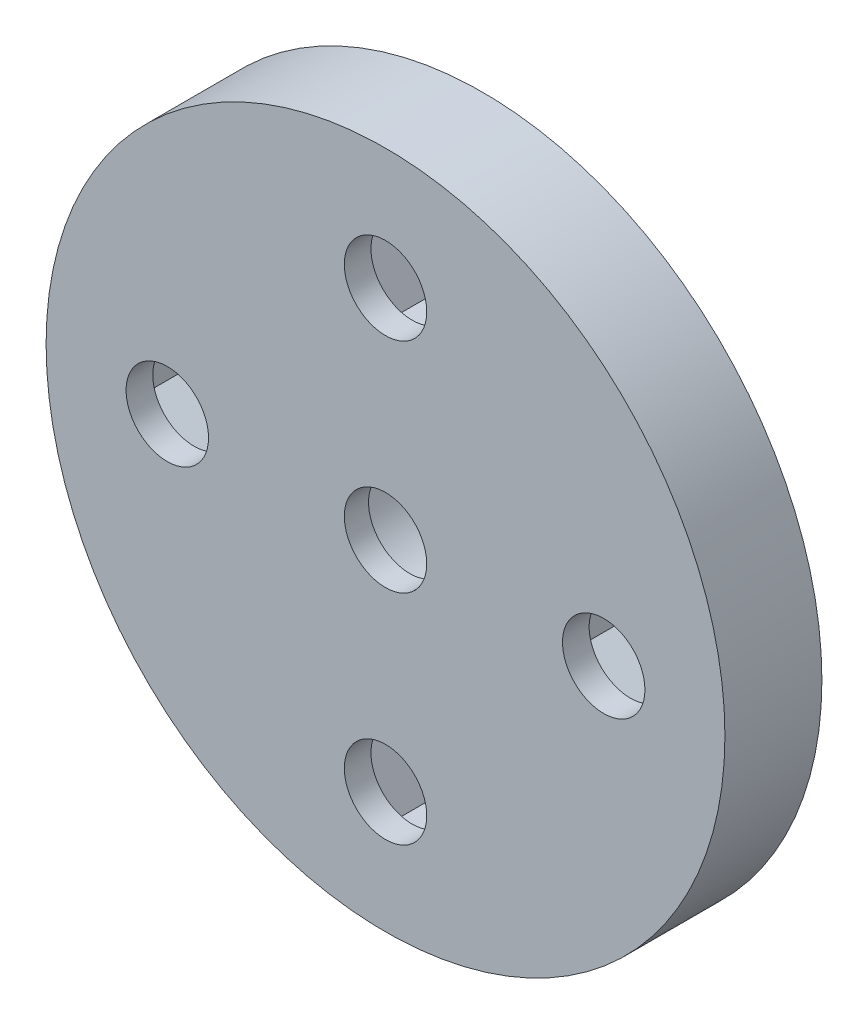
ISO-10303-21;
HEADER;
FILE_DESCRIPTION(('STEP AP214'),'2;1');
FILE_NAME('part.step','',(''),(''),'','','');
FILE_SCHEMA(('AUTOMOTIVE_DESIGN { 1 0 10303 214 1 1 1 1 }'));
ENDSEC;
DATA;
#1=APPLICATION_CONTEXT('core data for automotive mechanical design processes');
#2=APPLICATION_PROTOCOL_DEFINITION('international standard','automotive_design',2000,#1);
#3=PRODUCT_CONTEXT('',#1,'mechanical');
#4=PRODUCT('Part','Part','',(#3));
#5=PRODUCT_RELATED_PRODUCT_CATEGORY('part','',(#4));
#6=PRODUCT_DEFINITION_FORMATION('','',#4);
#7=PRODUCT_DEFINITION_CONTEXT('part definition',#1,'design');
#8=PRODUCT_DEFINITION('design','',#6,#7);
#9=PRODUCT_DEFINITION_SHAPE('','',#8);
#10=(LENGTH_UNIT() NAMED_UNIT(*) SI_UNIT(.MILLI.,.METRE.));
#11=(NAMED_UNIT(*) PLANE_ANGLE_UNIT() SI_UNIT($,.RADIAN.));
#12=(NAMED_UNIT(*) SI_UNIT($,.STERADIAN.) SOLID_ANGLE_UNIT());
#13=UNCERTAINTY_MEASURE_WITH_UNIT(LENGTH_MEASURE(1.E-05),#10,'distance_accuracy_value','');
#14=(GEOMETRIC_REPRESENTATION_CONTEXT(3) GLOBAL_UNCERTAINTY_ASSIGNED_CONTEXT((#13)) GLOBAL_UNIT_ASSIGNED_CONTEXT((#10,
#11,#12)) REPRESENTATION_CONTEXT('',''));
#15=CARTESIAN_POINT('',(0.,0.,0.));
#16=DIRECTION('',(0.,0.,1.));
#17=DIRECTION('',(1.,0.,0.));
#18=AXIS2_PLACEMENT_3D('',#15,#16,#17);
#19=CARTESIAN_POINT('',(0.,0.,0.));
#20=DIRECTION('',(0.,0.,1.));
#21=DIRECTION('',(1.,0.,0.));
#22=AXIS2_PLACEMENT_3D('',#19,#20,#21);
#23=PLANE('',#22);
#24=DIRECTION('',(-1.,0.,0.));
#25=VECTOR('',#24,1.);
#26=CARTESIAN_POINT('',(1.64544826719043,11.85,0.));
#27=LINE('',#26,#25);
#28=CARTESIAN_POINT('',(1.64544826719043,11.85,0.));
#29=VERTEX_POINT('',#28);
#30=CARTESIAN_POINT('',(-1.64544826719043,11.85,0.));
#31=VERTEX_POINT('',#30);
#32=EDGE_CURVE('E72',#29,#31,#27,.T.);
#33=ORIENTED_EDGE('',*,*,#32,.T.);
#34=DIRECTION('',(-0.5,-0.866025403784439,0.));
#35=VECTOR('',#34,1.);
#36=CARTESIAN_POINT('',(-1.64544826719043,11.85,0.));
#37=LINE('',#36,#35);
#38=CARTESIAN_POINT('',(-3.29089653438087,9.,0.));
#39=VERTEX_POINT('',#38);
#40=EDGE_CURVE('E281',#31,#39,#37,.T.);
#41=ORIENTED_EDGE('',*,*,#40,.T.);
#42=DIRECTION('',(0.5,-0.866025403784439,0.));
#43=VECTOR('',#42,1.);
#44=CARTESIAN_POINT('',(-3.29089653438087,9.,0.));
#45=LINE('',#44,#43);
#46=CARTESIAN_POINT('',(-1.64544826719044,6.15,0.));
#47=VERTEX_POINT('',#46);
#48=EDGE_CURVE('E278',#39,#47,#45,.T.);
#49=ORIENTED_EDGE('',*,*,#48,.T.);
#50=DIRECTION('',(1.,0.,0.));
#51=VECTOR('',#50,1.);
#52=CARTESIAN_POINT('',(-1.64544826719044,6.15,0.));
#53=LINE('',#52,#51);
#54=CARTESIAN_POINT('',(1.64544826719043,6.15,0.));
#55=VERTEX_POINT('',#54);
#56=EDGE_CURVE('E277',#47,#55,#53,.T.);
#57=ORIENTED_EDGE('',*,*,#56,.T.);
#58=DIRECTION('',(0.5,0.866025403784439,0.));
#59=VECTOR('',#58,1.);
#60=CARTESIAN_POINT('',(1.64544826719043,6.15,0.));
#61=LINE('',#60,#59);
#62=CARTESIAN_POINT('',(3.29089653438087,9.,0.));
#63=VERTEX_POINT('',#62);
#64=EDGE_CURVE('E271',#55,#63,#61,.T.);
#65=ORIENTED_EDGE('',*,*,#64,.T.);
#66=DIRECTION('',(-0.5,0.866025403784439,0.));
#67=VECTOR('',#66,1.);
#68=CARTESIAN_POINT('',(3.29089653438087,9.,0.));
#69=LINE('',#68,#67);
#70=EDGE_CURVE('E270',#63,#29,#69,.T.);
#71=ORIENTED_EDGE('',*,*,#70,.T.);
#72=EDGE_LOOP('',(#33,#41,#49,#57,#65,#71));
#73=FACE_BOUND('',#72,.T.);
#74=DIRECTION('',(1.,0.,0.));
#75=VECTOR('',#74,1.);
#76=CARTESIAN_POINT('',(-1.64544826719044,-11.85,0.));
#77=LINE('',#76,#75);
#78=CARTESIAN_POINT('',(-1.64544826719044,-11.85,0.));
#79=VERTEX_POINT('',#78);
#80=CARTESIAN_POINT('',(1.64544826719043,-11.85,0.));
#81=VERTEX_POINT('',#80);
#82=EDGE_CURVE('E315',#79,#81,#77,.T.);
#83=ORIENTED_EDGE('',*,*,#82,.T.);
#84=DIRECTION('',(0.5,0.866025403784439,0.));
#85=VECTOR('',#84,1.);
#86=CARTESIAN_POINT('',(1.64544826719043,-11.85,0.));
#87=LINE('',#86,#85);
#88=CARTESIAN_POINT('',(3.29089653438087,-9.,0.));
#89=VERTEX_POINT('',#88);
#90=EDGE_CURVE('E409',#81,#89,#87,.T.);
#91=ORIENTED_EDGE('',*,*,#90,.T.);
#92=DIRECTION('',(-0.5,0.866025403784439,0.));
#93=VECTOR('',#92,1.);
#94=CARTESIAN_POINT('',(3.29089653438087,-9.,0.));
#95=LINE('',#94,#93);
#96=CARTESIAN_POINT('',(1.64544826719043,-6.15,0.));
#97=VERTEX_POINT('',#96);
#98=EDGE_CURVE('E404',#89,#97,#95,.T.);
#99=ORIENTED_EDGE('',*,*,#98,.T.);
#100=DIRECTION('',(-1.,0.,0.));
#101=VECTOR('',#100,1.);
#102=CARTESIAN_POINT('',(1.64544826719043,-6.15,0.));
#103=LINE('',#102,#101);
#104=CARTESIAN_POINT('',(-1.64544826719043,-6.15,0.));
#105=VERTEX_POINT('',#104);
#106=EDGE_CURVE('E396',#97,#105,#103,.T.);
#107=ORIENTED_EDGE('',*,*,#106,.T.);
#108=DIRECTION('',(-0.5,-0.866025403784438,0.));
#109=VECTOR('',#108,1.);
#110=CARTESIAN_POINT('',(-1.64544826719043,-6.15,0.));
#111=LINE('',#110,#109);
#112=CARTESIAN_POINT('',(-3.29089653438087,-9.,0.));
#113=VERTEX_POINT('',#112);
#114=EDGE_CURVE('E393',#105,#113,#111,.T.);
#115=ORIENTED_EDGE('',*,*,#114,.T.);
#116=DIRECTION('',(0.5,-0.866025403784439,0.));
#117=VECTOR('',#116,1.);
#118=CARTESIAN_POINT('',(-3.29089653438087,-9.,0.));
#119=LINE('',#118,#117);
#120=EDGE_CURVE('E392',#113,#79,#119,.T.);
#121=ORIENTED_EDGE('',*,*,#120,.T.);
#122=EDGE_LOOP('',(#83,#91,#99,#107,#115,#121));
#123=FACE_BOUND('',#122,.T.);
#124=CARTESIAN_POINT('',(0.,0.,0.));
#125=DIRECTION('',(0.,0.,1.));
#126=DIRECTION('',(1.,0.,0.));
#127=AXIS2_PLACEMENT_3D('',#124,#125,#126);
#128=CIRCLE('',#127,2.9);
#129=CARTESIAN_POINT('',(2.9,0.,0.));
#130=VERTEX_POINT('',#129);
#131=EDGE_CURVE('E460',#130,#130,#128,.T.);
#132=ORIENTED_EDGE('',*,*,#131,.T.);
#133=EDGE_LOOP('',(#132));
#134=FACE_BOUND('',#133,.T.);
#135=CARTESIAN_POINT('',(0.,0.,0.));
#136=DIRECTION('',(0.,0.,1.));
#137=DIRECTION('',(1.,0.,0.));
#138=AXIS2_PLACEMENT_3D('',#135,#136,#137);
#139=CIRCLE('',#138,14.);
#140=CARTESIAN_POINT('',(14.,0.,0.));
#141=VERTEX_POINT('',#140);
#142=EDGE_CURVE('E54',#141,#141,#139,.T.);
#143=ORIENTED_EDGE('',*,*,#142,.F.);
#144=EDGE_LOOP('',(#143));
#145=FACE_BOUND('',#144,.T.);
#146=DIRECTION('',(0.,-1.,0.));
#147=VECTOR('',#146,1.);
#148=CARTESIAN_POINT('',(-11.85,1.64544826719043,0.));
#149=LINE('',#148,#147);
#150=CARTESIAN_POINT('',(-11.85,1.64544826719043,0.));
#151=VERTEX_POINT('',#150);
#152=CARTESIAN_POINT('',(-11.85,-1.64544826719043,0.));
#153=VERTEX_POINT('',#152);
#154=EDGE_CURVE('E253',#151,#153,#149,.T.);
#155=ORIENTED_EDGE('',*,*,#154,.T.);
#156=DIRECTION('',(0.866025403784439,-0.5,0.));
#157=VECTOR('',#156,1.);
#158=CARTESIAN_POINT('',(-11.85,-1.64544826719043,0.));
#159=LINE('',#158,#157);
#160=CARTESIAN_POINT('',(-9.,-3.29089653438087,0.));
#161=VERTEX_POINT('',#160);
#162=EDGE_CURVE('E347',#153,#161,#159,.T.);
#163=ORIENTED_EDGE('',*,*,#162,.T.);
#164=DIRECTION('',(0.866025403784439,0.5,0.));
#165=VECTOR('',#164,1.);
#166=CARTESIAN_POINT('',(-9.,-3.29089653438087,0.));
#167=LINE('',#166,#165);
#168=CARTESIAN_POINT('',(-6.15,-1.64544826719044,0.));
#169=VERTEX_POINT('',#168);
#170=EDGE_CURVE('E345',#161,#169,#167,.T.);
#171=ORIENTED_EDGE('',*,*,#170,.T.);
#172=DIRECTION('',(0.,1.,0.));
#173=VECTOR('',#172,1.);
#174=CARTESIAN_POINT('',(-6.15,-1.64544826719044,0.));
#175=LINE('',#174,#173);
#176=CARTESIAN_POINT('',(-6.15,1.64544826719043,0.));
#177=VERTEX_POINT('',#176);
#178=EDGE_CURVE('E339',#169,#177,#175,.T.);
#179=ORIENTED_EDGE('',*,*,#178,.T.);
#180=DIRECTION('',(-0.866025403784438,0.5,0.));
#181=VECTOR('',#180,1.);
#182=CARTESIAN_POINT('',(-6.15,1.64544826719043,0.));
#183=LINE('',#182,#181);
#184=CARTESIAN_POINT('',(-9.,3.29089653438087,0.));
#185=VERTEX_POINT('',#184);
#186=EDGE_CURVE('E334',#177,#185,#183,.T.);
#187=ORIENTED_EDGE('',*,*,#186,.T.);
#188=DIRECTION('',(-0.866025403784439,-0.5,0.));
#189=VECTOR('',#188,1.);
#190=CARTESIAN_POINT('',(-9.,3.29089653438087,0.));
#191=LINE('',#190,#189);
#192=EDGE_CURVE('E328',#185,#151,#191,.T.);
#193=ORIENTED_EDGE('',*,*,#192,.T.);
#194=EDGE_LOOP('',(#155,#163,#171,#179,#187,#193));
#195=FACE_BOUND('',#194,.T.);
#196=DIRECTION('',(0.,1.,0.));
#197=VECTOR('',#196,1.);
#198=CARTESIAN_POINT('',(11.85,-1.64544826719044,0.));
#199=LINE('',#198,#197);
#200=CARTESIAN_POINT('',(11.85,-1.64544826719044,0.));
#201=VERTEX_POINT('',#200);
#202=CARTESIAN_POINT('',(11.85,1.64544826719043,0.));
#203=VERTEX_POINT('',#202);
#204=EDGE_CURVE('E64',#201,#203,#199,.T.);
#205=ORIENTED_EDGE('',*,*,#204,.T.);
#206=DIRECTION('',(-0.866025403784439,0.5,0.));
#207=VECTOR('',#206,1.);
#208=CARTESIAN_POINT('',(11.85,1.64544826719043,0.));
#209=LINE('',#208,#207);
#210=CARTESIAN_POINT('',(9.,3.29089653438087,0.));
#211=VERTEX_POINT('',#210);
#212=EDGE_CURVE('E233',#203,#211,#209,.T.);
#213=ORIENTED_EDGE('',*,*,#212,.T.);
#214=DIRECTION('',(-0.866025403784439,-0.5,0.));
#215=VECTOR('',#214,1.);
#216=CARTESIAN_POINT('',(9.,3.29089653438087,0.));
#217=LINE('',#216,#215);
#218=CARTESIAN_POINT('',(6.15,1.64544826719043,0.));
#219=VERTEX_POINT('',#218);
#220=EDGE_CURVE('E514',#211,#219,#217,.T.);
#221=ORIENTED_EDGE('',*,*,#220,.T.);
#222=DIRECTION('',(0.,-1.,0.));
#223=VECTOR('',#222,1.);
#224=CARTESIAN_POINT('',(6.15,1.64544826719043,0.));
#225=LINE('',#224,#223);
#226=CARTESIAN_POINT('',(6.15,-1.64544826719043,0.));
#227=VERTEX_POINT('',#226);
#228=EDGE_CURVE('E525',#219,#227,#225,.T.);
#229=ORIENTED_EDGE('',*,*,#228,.T.);
#230=DIRECTION('',(0.866025403784439,-0.5,0.));
#231=VECTOR('',#230,1.);
#232=CARTESIAN_POINT('',(6.15,-1.64544826719043,0.));
#233=LINE('',#232,#231);
#234=CARTESIAN_POINT('',(9.,-3.29089653438087,0.));
#235=VERTEX_POINT('',#234);
#236=EDGE_CURVE('E528',#227,#235,#233,.T.);
#237=ORIENTED_EDGE('',*,*,#236,.T.);
#238=DIRECTION('',(0.866025403784439,0.5,0.));
#239=VECTOR('',#238,1.);
#240=CARTESIAN_POINT('',(9.,-3.29089653438087,0.));
#241=LINE('',#240,#239);
#242=EDGE_CURVE('E226',#235,#201,#241,.T.);
#243=ORIENTED_EDGE('',*,*,#242,.T.);
#244=EDGE_LOOP('',(#205,#213,#221,#229,#237,#243));
#245=FACE_BOUND('',#244,.T.);
#246=ADVANCED_FACE('F44',(#73,#123,#134,#145,#195,#245),#23,.F.);
#247=CARTESIAN_POINT('',(0.,0.,4.00000000000001));
#248=DIRECTION('',(0.,0.,-1.));
#249=DIRECTION('',(-1.,0.,0.));
#250=AXIS2_PLACEMENT_3D('',#247,#248,#249);
#251=CYLINDRICAL_SURFACE('',#250,14.);
#252=CARTESIAN_POINT('',(0.,0.,4.00000000000001));
#253=DIRECTION('',(0.,0.,1.));
#254=DIRECTION('',(1.,0.,0.));
#255=AXIS2_PLACEMENT_3D('',#252,#253,#254);
#256=CIRCLE('',#255,14.);
#257=CARTESIAN_POINT('',(14.,0.,4.00000000000001));
#258=VERTEX_POINT('',#257);
#259=EDGE_CURVE('E11',#258,#258,#256,.T.);
#260=ORIENTED_EDGE('',*,*,#259,.F.);
#261=EDGE_LOOP('',(#260));
#262=FACE_BOUND('',#261,.T.);
#263=ORIENTED_EDGE('',*,*,#142,.T.);
#264=EDGE_LOOP('',(#263));
#265=FACE_BOUND('',#264,.T.);
#266=ADVANCED_FACE('F50',(#262,#265),#251,.T.);
#267=CARTESIAN_POINT('',(0.,0.,4.00000000000001));
#268=DIRECTION('',(0.,0.,1.));
#269=DIRECTION('',(1.,0.,0.));
#270=AXIS2_PLACEMENT_3D('',#267,#268,#269);
#271=PLANE('',#270);
#272=CARTESIAN_POINT('',(9.,0.,4.));
#273=DIRECTION('',(0.,0.,1.));
#274=DIRECTION('',(1.,0.,0.));
#275=AXIS2_PLACEMENT_3D('',#272,#273,#274);
#276=CIRCLE('',#275,1.7);
#277=CARTESIAN_POINT('',(10.7,0.,4.));
#278=VERTEX_POINT('',#277);
#279=EDGE_CURVE('E435',#278,#278,#276,.T.);
#280=ORIENTED_EDGE('',*,*,#279,.F.);
#281=EDGE_LOOP('',(#280));
#282=FACE_BOUND('',#281,.T.);
#283=CARTESIAN_POINT('',(0.,9.,4.));
#284=DIRECTION('',(0.,0.,1.));
#285=DIRECTION('',(1.,0.,0.));
#286=AXIS2_PLACEMENT_3D('',#283,#284,#285);
#287=CIRCLE('',#286,1.7);
#288=CARTESIAN_POINT('',(1.7,9.,4.));
#289=VERTEX_POINT('',#288);
#290=EDGE_CURVE('E440',#289,#289,#287,.T.);
#291=ORIENTED_EDGE('',*,*,#290,.F.);
#292=EDGE_LOOP('',(#291));
#293=FACE_BOUND('',#292,.T.);
#294=CARTESIAN_POINT('',(-9.,0.,4.));
#295=DIRECTION('',(0.,0.,1.));
#296=DIRECTION('',(1.,0.,0.));
#297=AXIS2_PLACEMENT_3D('',#294,#295,#296);
#298=CIRCLE('',#297,1.7);
#299=CARTESIAN_POINT('',(-7.3,0.,4.));
#300=VERTEX_POINT('',#299);
#301=EDGE_CURVE('E442',#300,#300,#298,.T.);
#302=ORIENTED_EDGE('',*,*,#301,.F.);
#303=EDGE_LOOP('',(#302));
#304=FACE_BOUND('',#303,.T.);
#305=CARTESIAN_POINT('',(0.,-9.,4.));
#306=DIRECTION('',(0.,0.,1.));
#307=DIRECTION('',(1.,0.,0.));
#308=AXIS2_PLACEMENT_3D('',#305,#306,#307);
#309=CIRCLE('',#308,1.7);
#310=CARTESIAN_POINT('',(1.7,-9.,4.));
#311=VERTEX_POINT('',#310);
#312=EDGE_CURVE('E443',#311,#311,#309,.T.);
#313=ORIENTED_EDGE('',*,*,#312,.F.);
#314=EDGE_LOOP('',(#313));
#315=FACE_BOUND('',#314,.T.);
#316=CARTESIAN_POINT('',(0.,0.,4.));
#317=DIRECTION('',(0.,0.,1.));
#318=DIRECTION('',(1.,0.,0.));
#319=AXIS2_PLACEMENT_3D('',#316,#317,#318);
#320=CIRCLE('',#319,1.7);
#321=CARTESIAN_POINT('',(1.7,0.,4.));
#322=VERTEX_POINT('',#321);
#323=EDGE_CURVE('E436',#322,#322,#320,.T.);
#324=ORIENTED_EDGE('',*,*,#323,.F.);
#325=EDGE_LOOP('',(#324));
#326=FACE_BOUND('',#325,.T.);
#327=ORIENTED_EDGE('',*,*,#259,.T.);
#328=EDGE_LOOP('',(#327));
#329=FACE_BOUND('',#328,.T.);
#330=ADVANCED_FACE('F487',(#282,#293,#304,#315,#326,#329),#271,.T.);
#331=CARTESIAN_POINT('',(0.,0.,3.00000000000001));
#332=DIRECTION('',(0.,0.,-1.));
#333=DIRECTION('',(-1.,0.,0.));
#334=AXIS2_PLACEMENT_3D('',#331,#332,#333);
#335=CYLINDRICAL_SURFACE('',#334,2.9);
#336=CARTESIAN_POINT('',(0.,0.,3.00000000000001));
#337=DIRECTION('',(0.,0.,1.));
#338=DIRECTION('',(1.,0.,0.));
#339=AXIS2_PLACEMENT_3D('',#336,#337,#338);
#340=CIRCLE('',#339,2.9);
#341=CARTESIAN_POINT('',(2.9,0.,3.00000000000001));
#342=VERTEX_POINT('',#341);
#343=EDGE_CURVE('E453',#342,#342,#340,.T.);
#344=ORIENTED_EDGE('',*,*,#343,.T.);
#345=EDGE_LOOP('',(#344));
#346=FACE_BOUND('',#345,.T.);
#347=ORIENTED_EDGE('',*,*,#131,.F.);
#348=EDGE_LOOP('',(#347));
#349=FACE_BOUND('',#348,.T.);
#350=ADVANCED_FACE('F495',(#346,#349),#335,.F.);
#351=CARTESIAN_POINT('',(0.,0.,3.00000000000001));
#352=DIRECTION('',(0.,0.,1.));
#353=DIRECTION('',(1.,0.,0.));
#354=AXIS2_PLACEMENT_3D('',#351,#352,#353);
#355=PLANE('',#354);
#356=CARTESIAN_POINT('',(0.,0.,3.00000000000001));
#357=DIRECTION('',(0.,0.,1.));
#358=DIRECTION('',(1.,0.,0.));
#359=AXIS2_PLACEMENT_3D('',#356,#357,#358);
#360=CIRCLE('',#359,1.7);
#361=CARTESIAN_POINT('',(1.7,0.,3.00000000000001));
#362=VERTEX_POINT('',#361);
#363=EDGE_CURVE('E455',#362,#362,#360,.F.);
#364=ORIENTED_EDGE('',*,*,#363,.F.);
#365=EDGE_LOOP('',(#364));
#366=FACE_BOUND('',#365,.T.);
#367=ORIENTED_EDGE('',*,*,#343,.F.);
#368=EDGE_LOOP('',(#367));
#369=FACE_BOUND('',#368,.T.);
#370=ADVANCED_FACE('F673',(#366,#369),#355,.F.);
#371=CARTESIAN_POINT('',(0.,0.,4.));
#372=DIRECTION('',(0.,0.,-1.));
#373=DIRECTION('',(-1.,0.,0.));
#374=AXIS2_PLACEMENT_3D('',#371,#372,#373);
#375=CYLINDRICAL_SURFACE('',#374,1.7);
#376=ORIENTED_EDGE('',*,*,#323,.T.);
#377=EDGE_LOOP('',(#376));
#378=FACE_BOUND('',#377,.T.);
#379=ORIENTED_EDGE('',*,*,#363,.T.);
#380=EDGE_LOOP('',(#379));
#381=FACE_BOUND('',#380,.T.);
#382=ADVANCED_FACE('F484',(#378,#381),#375,.F.);
#383=CARTESIAN_POINT('',(0.,-9.,4.));
#384=DIRECTION('',(0.,0.,-1.));
#385=DIRECTION('',(-1.,0.,0.));
#386=AXIS2_PLACEMENT_3D('',#383,#384,#385);
#387=CYLINDRICAL_SURFACE('',#386,1.7);
#388=CARTESIAN_POINT('',(0.,-9.,2.9));
#389=DIRECTION('',(0.,0.,1.));
#390=DIRECTION('',(1.,0.,0.));
#391=AXIS2_PLACEMENT_3D('',#388,#389,#390);
#392=CIRCLE('',#391,1.7);
#393=CARTESIAN_POINT('',(1.7,-9.,2.9));
#394=VERTEX_POINT('',#393);
#395=EDGE_CURVE('E47',#394,#394,#392,.T.);
#396=ORIENTED_EDGE('',*,*,#395,.F.);
#397=EDGE_LOOP('',(#396));
#398=FACE_BOUND('',#397,.T.);
#399=ORIENTED_EDGE('',*,*,#312,.T.);
#400=EDGE_LOOP('',(#399));
#401=FACE_BOUND('',#400,.T.);
#402=ADVANCED_FACE('F481',(#398,#401),#387,.F.);
#403=CARTESIAN_POINT('',(-9.,0.,4.));
#404=DIRECTION('',(0.,0.,-1.));
#405=DIRECTION('',(-1.,0.,0.));
#406=AXIS2_PLACEMENT_3D('',#403,#404,#405);
#407=CYLINDRICAL_SURFACE('',#406,1.7);
#408=CARTESIAN_POINT('',(-9.,0.,2.9));
#409=DIRECTION('',(0.,0.,1.));
#410=DIRECTION('',(1.,0.,0.));
#411=AXIS2_PLACEMENT_3D('',#408,#409,#410);
#412=CIRCLE('',#411,1.7);
#413=CARTESIAN_POINT('',(-7.3,0.,2.9));
#414=VERTEX_POINT('',#413);
#415=EDGE_CURVE('E469',#414,#414,#412,.T.);
#416=ORIENTED_EDGE('',*,*,#415,.F.);
#417=EDGE_LOOP('',(#416));
#418=FACE_BOUND('',#417,.T.);
#419=ORIENTED_EDGE('',*,*,#301,.T.);
#420=EDGE_LOOP('',(#419));
#421=FACE_BOUND('',#420,.T.);
#422=ADVANCED_FACE('F482',(#418,#421),#407,.F.);
#423=CARTESIAN_POINT('',(0.,9.,4.));
#424=DIRECTION('',(0.,0.,-1.));
#425=DIRECTION('',(-1.,0.,0.));
#426=AXIS2_PLACEMENT_3D('',#423,#424,#425);
#427=CYLINDRICAL_SURFACE('',#426,1.7);
#428=CARTESIAN_POINT('',(0.,9.,2.9));
#429=DIRECTION('',(0.,0.,1.));
#430=DIRECTION('',(1.,0.,0.));
#431=AXIS2_PLACEMENT_3D('',#428,#429,#430);
#432=CIRCLE('',#431,1.7);
#433=CARTESIAN_POINT('',(1.7,9.,2.9));
#434=VERTEX_POINT('',#433);
#435=EDGE_CURVE('E242',#434,#434,#432,.T.);
#436=ORIENTED_EDGE('',*,*,#435,.F.);
#437=EDGE_LOOP('',(#436));
#438=FACE_BOUND('',#437,.T.);
#439=ORIENTED_EDGE('',*,*,#290,.T.);
#440=EDGE_LOOP('',(#439));
#441=FACE_BOUND('',#440,.T.);
#442=ADVANCED_FACE('F664',(#438,#441),#427,.F.);
#443=CARTESIAN_POINT('',(9.,0.,4.));
#444=DIRECTION('',(0.,0.,-1.));
#445=DIRECTION('',(-1.,0.,0.));
#446=AXIS2_PLACEMENT_3D('',#443,#444,#445);
#447=CYLINDRICAL_SURFACE('',#446,1.7);
#448=CARTESIAN_POINT('',(9.,0.,2.9));
#449=DIRECTION('',(0.,0.,1.));
#450=DIRECTION('',(1.,0.,0.));
#451=AXIS2_PLACEMENT_3D('',#448,#449,#450);
#452=CIRCLE('',#451,1.7);
#453=CARTESIAN_POINT('',(10.7,0.,2.9));
#454=VERTEX_POINT('',#453);
#455=EDGE_CURVE('E231',#454,#454,#452,.T.);
#456=ORIENTED_EDGE('',*,*,#455,.F.);
#457=EDGE_LOOP('',(#456));
#458=FACE_BOUND('',#457,.T.);
#459=ORIENTED_EDGE('',*,*,#279,.T.);
#460=EDGE_LOOP('',(#459));
#461=FACE_BOUND('',#460,.T.);
#462=ADVANCED_FACE('F583',(#458,#461),#447,.F.);
#463=CARTESIAN_POINT('',(11.85,-1.64544826719044,2.9));
#464=DIRECTION('',(-1.,0.,0.));
#465=DIRECTION('',(0.,-1.,0.));
#466=AXIS2_PLACEMENT_3D('',#463,#464,#465);
#467=PLANE('',#466);
#468=ORIENTED_EDGE('',*,*,#204,.F.);
#469=DIRECTION('',(0.,0.,-1.));
#470=VECTOR('',#469,1.);
#471=CARTESIAN_POINT('',(11.85,-1.64544826719044,2.9));
#472=LINE('',#471,#470);
#473=CARTESIAN_POINT('',(11.85,-1.64544826719044,2.9));
#474=VERTEX_POINT('',#473);
#475=EDGE_CURVE('E230',#474,#201,#472,.T.);
#476=ORIENTED_EDGE('',*,*,#475,.F.);
#477=DIRECTION('',(0.,1.,0.));
#478=VECTOR('',#477,1.);
#479=CARTESIAN_POINT('',(11.85,-1.64544826719044,2.9));
#480=LINE('',#479,#478);
#481=CARTESIAN_POINT('',(11.85,1.64544826719043,2.9));
#482=VERTEX_POINT('',#481);
#483=EDGE_CURVE('E220',#474,#482,#480,.T.);
#484=ORIENTED_EDGE('',*,*,#483,.T.);
#485=DIRECTION('',(0.,0.,-1.));
#486=VECTOR('',#485,1.);
#487=CARTESIAN_POINT('',(11.85,1.64544826719043,2.9));
#488=LINE('',#487,#486);
#489=EDGE_CURVE('E227',#482,#203,#488,.T.);
#490=ORIENTED_EDGE('',*,*,#489,.T.);
#491=EDGE_LOOP('',(#468,#476,#484,#490));
#492=FACE_BOUND('',#491,.T.);
#493=ADVANCED_FACE('F223',(#492),#467,.T.);
#494=CARTESIAN_POINT('',(11.85,1.64544826719043,2.9));
#495=DIRECTION('',(-0.5,-0.866025403784439,0.));
#496=DIRECTION('',(0.866025403784439,-0.5,0.));
#497=AXIS2_PLACEMENT_3D('',#494,#495,#496);
#498=PLANE('',#497);
#499=ORIENTED_EDGE('',*,*,#212,.F.);
#500=ORIENTED_EDGE('',*,*,#489,.F.);
#501=DIRECTION('',(-0.866025403784439,0.5,0.));
#502=VECTOR('',#501,1.);
#503=CARTESIAN_POINT('',(11.85,1.64544826719043,2.9));
#504=LINE('',#503,#502);
#505=CARTESIAN_POINT('',(9.,3.29089653438087,2.9));
#506=VERTEX_POINT('',#505);
#507=EDGE_CURVE('E213',#482,#506,#504,.T.);
#508=ORIENTED_EDGE('',*,*,#507,.T.);
#509=DIRECTION('',(0.,0.,-1.));
#510=VECTOR('',#509,1.);
#511=CARTESIAN_POINT('',(9.,3.29089653438087,2.9));
#512=LINE('',#511,#510);
#513=EDGE_CURVE('E237',#506,#211,#512,.T.);
#514=ORIENTED_EDGE('',*,*,#513,.T.);
#515=EDGE_LOOP('',(#499,#500,#508,#514));
#516=FACE_BOUND('',#515,.T.);
#517=ADVANCED_FACE('F232',(#516),#498,.T.);
#518=CARTESIAN_POINT('',(9.,3.29089653438087,2.9));
#519=DIRECTION('',(0.5,-0.866025403784439,0.));
#520=DIRECTION('',(0.866025403784439,0.5,0.));
#521=AXIS2_PLACEMENT_3D('',#518,#519,#520);
#522=PLANE('',#521);
#523=ORIENTED_EDGE('',*,*,#220,.F.);
#524=ORIENTED_EDGE('',*,*,#513,.F.);
#525=DIRECTION('',(-0.866025403784439,-0.5,0.));
#526=VECTOR('',#525,1.);
#527=CARTESIAN_POINT('',(9.,3.29089653438087,2.9));
#528=LINE('',#527,#526);
#529=CARTESIAN_POINT('',(6.15,1.64544826719043,2.9));
#530=VERTEX_POINT('',#529);
#531=EDGE_CURVE('E218',#506,#530,#528,.T.);
#532=ORIENTED_EDGE('',*,*,#531,.T.);
#533=DIRECTION('',(0.,0.,-1.));
#534=VECTOR('',#533,1.);
#535=CARTESIAN_POINT('',(6.15,1.64544826719043,2.9));
#536=LINE('',#535,#534);
#537=EDGE_CURVE('E244',#530,#219,#536,.T.);
#538=ORIENTED_EDGE('',*,*,#537,.T.);
#539=EDGE_LOOP('',(#523,#524,#532,#538));
#540=FACE_BOUND('',#539,.T.);
#541=ADVANCED_FACE('F543',(#540),#522,.T.);
#542=CARTESIAN_POINT('',(6.15,1.64544826719043,2.9));
#543=DIRECTION('',(1.,0.,0.));
#544=DIRECTION('',(0.,1.,0.));
#545=AXIS2_PLACEMENT_3D('',#542,#543,#544);
#546=PLANE('',#545);
#547=ORIENTED_EDGE('',*,*,#228,.F.);
#548=ORIENTED_EDGE('',*,*,#537,.F.);
#549=DIRECTION('',(0.,-1.,0.));
#550=VECTOR('',#549,1.);
#551=CARTESIAN_POINT('',(6.15,1.64544826719043,2.9));
#552=LINE('',#551,#550);
#553=CARTESIAN_POINT('',(6.15,-1.64544826719043,2.9));
#554=VERTEX_POINT('',#553);
#555=EDGE_CURVE('E560',#530,#554,#552,.T.);
#556=ORIENTED_EDGE('',*,*,#555,.T.);
#557=DIRECTION('',(0.,0.,-1.));
#558=VECTOR('',#557,1.);
#559=CARTESIAN_POINT('',(6.15,-1.64544826719043,2.9));
#560=LINE('',#559,#558);
#561=EDGE_CURVE('E536',#554,#227,#560,.T.);
#562=ORIENTED_EDGE('',*,*,#561,.T.);
#563=EDGE_LOOP('',(#547,#548,#556,#562));
#564=FACE_BOUND('',#563,.T.);
#565=ADVANCED_FACE('F544',(#564),#546,.T.);
#566=CARTESIAN_POINT('',(6.15,-1.64544826719043,2.9));
#567=DIRECTION('',(0.5,0.866025403784439,0.));
#568=DIRECTION('',(-0.866025403784439,0.5,0.));
#569=AXIS2_PLACEMENT_3D('',#566,#567,#568);
#570=PLANE('',#569);
#571=ORIENTED_EDGE('',*,*,#236,.F.);
#572=ORIENTED_EDGE('',*,*,#561,.F.);
#573=DIRECTION('',(0.866025403784439,-0.5,0.));
#574=VECTOR('',#573,1.);
#575=CARTESIAN_POINT('',(6.15,-1.64544826719043,2.9));
#576=LINE('',#575,#574);
#577=CARTESIAN_POINT('',(9.,-3.29089653438087,2.9));
#578=VERTEX_POINT('',#577);
#579=EDGE_CURVE('E555',#554,#578,#576,.T.);
#580=ORIENTED_EDGE('',*,*,#579,.T.);
#581=DIRECTION('',(0.,0.,-1.));
#582=VECTOR('',#581,1.);
#583=CARTESIAN_POINT('',(9.,-3.29089653438087,2.9));
#584=LINE('',#583,#582);
#585=EDGE_CURVE('E531',#578,#235,#584,.T.);
#586=ORIENTED_EDGE('',*,*,#585,.T.);
#587=EDGE_LOOP('',(#571,#572,#580,#586));
#588=FACE_BOUND('',#587,.T.);
#589=ADVANCED_FACE('F548',(#588),#570,.T.);
#590=CARTESIAN_POINT('',(9.,-3.29089653438087,2.9));
#591=DIRECTION('',(-0.5,0.866025403784439,0.));
#592=DIRECTION('',(-0.866025403784439,-0.5,0.));
#593=AXIS2_PLACEMENT_3D('',#590,#591,#592);
#594=PLANE('',#593);
#595=ORIENTED_EDGE('',*,*,#242,.F.);
#596=ORIENTED_EDGE('',*,*,#585,.F.);
#597=DIRECTION('',(0.866025403784439,0.5,0.));
#598=VECTOR('',#597,1.);
#599=CARTESIAN_POINT('',(9.,-3.29089653438087,2.9));
#600=LINE('',#599,#598);
#601=EDGE_CURVE('E520',#578,#474,#600,.T.);
#602=ORIENTED_EDGE('',*,*,#601,.T.);
#603=ORIENTED_EDGE('',*,*,#475,.T.);
#604=EDGE_LOOP('',(#595,#596,#602,#603));
#605=FACE_BOUND('',#604,.T.);
#606=ADVANCED_FACE('F551',(#605),#594,.T.);
#607=CARTESIAN_POINT('',(0.,0.,2.9));
#608=DIRECTION('',(0.,0.,1.));
#609=DIRECTION('',(1.,0.,0.));
#610=AXIS2_PLACEMENT_3D('',#607,#608,#609);
#611=PLANE('',#610);
#612=ORIENTED_EDGE('',*,*,#455,.T.);
#613=EDGE_LOOP('',(#612));
#614=FACE_BOUND('',#613,.T.);
#615=ORIENTED_EDGE('',*,*,#483,.F.);
#616=ORIENTED_EDGE('',*,*,#601,.F.);
#617=ORIENTED_EDGE('',*,*,#579,.F.);
#618=ORIENTED_EDGE('',*,*,#555,.F.);
#619=ORIENTED_EDGE('',*,*,#531,.F.);
#620=ORIENTED_EDGE('',*,*,#507,.F.);
#621=EDGE_LOOP('',(#615,#616,#617,#618,#619,#620));
#622=FACE_BOUND('',#621,.T.);
#623=ADVANCED_FACE('F214',(#614,#622),#611,.F.);
#624=CARTESIAN_POINT('',(1.64544826719043,11.85,2.9));
#625=DIRECTION('',(0.,-1.,0.));
#626=DIRECTION('',(0.,0.,-1.));
#627=AXIS2_PLACEMENT_3D('',#624,#625,#626);
#628=PLANE('',#627);
#629=ORIENTED_EDGE('',*,*,#32,.F.);
#630=DIRECTION('',(0.,0.,-1.));
#631=VECTOR('',#630,1.);
#632=CARTESIAN_POINT('',(1.64544826719043,11.85,2.9));
#633=LINE('',#632,#631);
#634=CARTESIAN_POINT('',(1.64544826719043,11.85,2.9));
#635=VERTEX_POINT('',#634);
#636=EDGE_CURVE('E263',#635,#29,#633,.T.);
#637=ORIENTED_EDGE('',*,*,#636,.F.);
#638=DIRECTION('',(-1.,0.,0.));
#639=VECTOR('',#638,1.);
#640=CARTESIAN_POINT('',(1.64544826719043,11.85,2.9));
#641=LINE('',#640,#639);
#642=CARTESIAN_POINT('',(-1.64544826719043,11.85,2.9));
#643=VERTEX_POINT('',#642);
#644=EDGE_CURVE('E275',#635,#643,#641,.T.);
#645=ORIENTED_EDGE('',*,*,#644,.T.);
#646=DIRECTION('',(0.,0.,-1.));
#647=VECTOR('',#646,1.);
#648=CARTESIAN_POINT('',(-1.64544826719043,11.85,2.9));
#649=LINE('',#648,#647);
#650=EDGE_CURVE('E250',#643,#31,#649,.T.);
#651=ORIENTED_EDGE('',*,*,#650,.T.);
#652=EDGE_LOOP('',(#629,#637,#645,#651));
#653=FACE_BOUND('',#652,.T.);
#654=ADVANCED_FACE('F566',(#653),#628,.T.);
#655=CARTESIAN_POINT('',(-1.64544826719043,11.85,2.9));
#656=DIRECTION('',(0.866025403784439,-0.5,0.));
#657=DIRECTION('',(0.5,0.866025403784439,0.));
#658=AXIS2_PLACEMENT_3D('',#655,#656,#657);
#659=PLANE('',#658);
#660=ORIENTED_EDGE('',*,*,#40,.F.);
#661=ORIENTED_EDGE('',*,*,#650,.F.);
#662=DIRECTION('',(-0.5,-0.866025403784439,0.));
#663=VECTOR('',#662,1.);
#664=CARTESIAN_POINT('',(-1.64544826719043,11.85,2.9));
#665=LINE('',#664,#663);
#666=CARTESIAN_POINT('',(-3.29089653438087,9.,2.9));
#667=VERTEX_POINT('',#666);
#668=EDGE_CURVE('E302',#643,#667,#665,.T.);
#669=ORIENTED_EDGE('',*,*,#668,.T.);
#670=DIRECTION('',(0.,0.,-1.));
#671=VECTOR('',#670,1.);
#672=CARTESIAN_POINT('',(-3.29089653438087,9.,2.9));
#673=LINE('',#672,#671);
#674=EDGE_CURVE('E246',#667,#39,#673,.T.);
#675=ORIENTED_EDGE('',*,*,#674,.T.);
#676=EDGE_LOOP('',(#660,#661,#669,#675));
#677=FACE_BOUND('',#676,.T.);
#678=ADVANCED_FACE('F585',(#677),#659,.T.);
#679=CARTESIAN_POINT('',(-3.29089653438087,9.,2.9));
#680=DIRECTION('',(0.866025403784439,0.5,0.));
#681=DIRECTION('',(-0.5,0.866025403784439,0.));
#682=AXIS2_PLACEMENT_3D('',#679,#680,#681);
#683=PLANE('',#682);
#684=ORIENTED_EDGE('',*,*,#48,.F.);
#685=ORIENTED_EDGE('',*,*,#674,.F.);
#686=DIRECTION('',(0.5,-0.866025403784439,0.));
#687=VECTOR('',#686,1.);
#688=CARTESIAN_POINT('',(-3.29089653438087,9.,2.9));
#689=LINE('',#688,#687);
#690=CARTESIAN_POINT('',(-1.64544826719044,6.15,2.9));
#691=VERTEX_POINT('',#690);
#692=EDGE_CURVE('E299',#667,#691,#689,.T.);
#693=ORIENTED_EDGE('',*,*,#692,.T.);
#694=DIRECTION('',(0.,0.,-1.));
#695=VECTOR('',#694,1.);
#696=CARTESIAN_POINT('',(-1.64544826719044,6.15,2.9));
#697=LINE('',#696,#695);
#698=EDGE_CURVE('E255',#691,#47,#697,.T.);
#699=ORIENTED_EDGE('',*,*,#698,.T.);
#700=EDGE_LOOP('',(#684,#685,#693,#699));
#701=FACE_BOUND('',#700,.T.);
#702=ADVANCED_FACE('F590',(#701),#683,.T.);
#703=CARTESIAN_POINT('',(-1.64544826719044,6.15,2.9));
#704=DIRECTION('',(0.,1.,0.));
#705=DIRECTION('',(0.,0.,1.));
#706=AXIS2_PLACEMENT_3D('',#703,#704,#705);
#707=PLANE('',#706);
#708=ORIENTED_EDGE('',*,*,#56,.F.);
#709=ORIENTED_EDGE('',*,*,#698,.F.);
#710=DIRECTION('',(1.,0.,0.));
#711=VECTOR('',#710,1.);
#712=CARTESIAN_POINT('',(-1.64544826719044,6.15,2.9));
#713=LINE('',#712,#711);
#714=CARTESIAN_POINT('',(1.64544826719043,6.15,2.9));
#715=VERTEX_POINT('',#714);
#716=EDGE_CURVE('E293',#691,#715,#713,.T.);
#717=ORIENTED_EDGE('',*,*,#716,.T.);
#718=DIRECTION('',(0.,0.,-1.));
#719=VECTOR('',#718,1.);
#720=CARTESIAN_POINT('',(1.64544826719043,6.15,2.9));
#721=LINE('',#720,#719);
#722=EDGE_CURVE('E260',#715,#55,#721,.T.);
#723=ORIENTED_EDGE('',*,*,#722,.T.);
#724=EDGE_LOOP('',(#708,#709,#717,#723));
#725=FACE_BOUND('',#724,.T.);
#726=ADVANCED_FACE('F591',(#725),#707,.T.);
#727=CARTESIAN_POINT('',(1.64544826719043,6.15,2.9));
#728=DIRECTION('',(-0.866025403784439,0.5,0.));
#729=DIRECTION('',(-0.5,-0.866025403784439,0.));
#730=AXIS2_PLACEMENT_3D('',#727,#728,#729);
#731=PLANE('',#730);
#732=ORIENTED_EDGE('',*,*,#64,.F.);
#733=ORIENTED_EDGE('',*,*,#722,.F.);
#734=DIRECTION('',(0.5,0.866025403784439,0.));
#735=VECTOR('',#734,1.);
#736=CARTESIAN_POINT('',(1.64544826719043,6.15,2.9));
#737=LINE('',#736,#735);
#738=CARTESIAN_POINT('',(3.29089653438087,9.,2.9));
#739=VERTEX_POINT('',#738);
#740=EDGE_CURVE('E295',#715,#739,#737,.T.);
#741=ORIENTED_EDGE('',*,*,#740,.T.);
#742=DIRECTION('',(0.,0.,-1.));
#743=VECTOR('',#742,1.);
#744=CARTESIAN_POINT('',(3.29089653438087,9.,2.9));
#745=LINE('',#744,#743);
#746=EDGE_CURVE('E257',#739,#63,#745,.T.);
#747=ORIENTED_EDGE('',*,*,#746,.T.);
#748=EDGE_LOOP('',(#732,#733,#741,#747));
#749=FACE_BOUND('',#748,.T.);
#750=ADVANCED_FACE('F594',(#749),#731,.T.);
#751=CARTESIAN_POINT('',(3.29089653438087,9.,2.9));
#752=DIRECTION('',(-0.866025403784439,-0.5,0.));
#753=DIRECTION('',(0.5,-0.866025403784439,0.));
#754=AXIS2_PLACEMENT_3D('',#751,#752,#753);
#755=PLANE('',#754);
#756=ORIENTED_EDGE('',*,*,#70,.F.);
#757=ORIENTED_EDGE('',*,*,#746,.F.);
#758=DIRECTION('',(-0.5,0.866025403784439,0.));
#759=VECTOR('',#758,1.);
#760=CARTESIAN_POINT('',(3.29089653438087,9.,2.9));
#761=LINE('',#760,#759);
#762=EDGE_CURVE('E266',#739,#635,#761,.T.);
#763=ORIENTED_EDGE('',*,*,#762,.T.);
#764=ORIENTED_EDGE('',*,*,#636,.T.);
#765=EDGE_LOOP('',(#756,#757,#763,#764));
#766=FACE_BOUND('',#765,.T.);
#767=ADVANCED_FACE('F597',(#766),#755,.T.);
#768=CARTESIAN_POINT('',(0.,0.,2.9));
#769=DIRECTION('',(0.,0.,1.));
#770=DIRECTION('',(1.,0.,0.));
#771=AXIS2_PLACEMENT_3D('',#768,#769,#770);
#772=PLANE('',#771);
#773=ORIENTED_EDGE('',*,*,#435,.T.);
#774=EDGE_LOOP('',(#773));
#775=FACE_BOUND('',#774,.T.);
#776=ORIENTED_EDGE('',*,*,#644,.F.);
#777=ORIENTED_EDGE('',*,*,#762,.F.);
#778=ORIENTED_EDGE('',*,*,#740,.F.);
#779=ORIENTED_EDGE('',*,*,#716,.F.);
#780=ORIENTED_EDGE('',*,*,#692,.F.);
#781=ORIENTED_EDGE('',*,*,#668,.F.);
#782=EDGE_LOOP('',(#776,#777,#778,#779,#780,#781));
#783=FACE_BOUND('',#782,.T.);
#784=ADVANCED_FACE('F602',(#775,#783),#772,.F.);
#785=CARTESIAN_POINT('',(-11.85,1.64544826719043,2.9));
#786=DIRECTION('',(1.,0.,0.));
#787=DIRECTION('',(0.,1.,0.));
#788=AXIS2_PLACEMENT_3D('',#785,#786,#787);
#789=PLANE('',#788);
#790=ORIENTED_EDGE('',*,*,#154,.F.);
#791=DIRECTION('',(0.,0.,-1.));
#792=VECTOR('',#791,1.);
#793=CARTESIAN_POINT('',(-11.85,1.64544826719043,2.9));
#794=LINE('',#793,#792);
#795=CARTESIAN_POINT('',(-11.85,1.64544826719043,2.9));
#796=VERTEX_POINT('',#795);
#797=EDGE_CURVE('E322',#796,#151,#794,.T.);
#798=ORIENTED_EDGE('',*,*,#797,.F.);
#799=DIRECTION('',(0.,-1.,0.));
#800=VECTOR('',#799,1.);
#801=CARTESIAN_POINT('',(-11.85,1.64544826719043,2.9));
#802=LINE('',#801,#800);
#803=CARTESIAN_POINT('',(-11.85,-1.64544826719043,2.9));
#804=VERTEX_POINT('',#803);
#805=EDGE_CURVE('E331',#796,#804,#802,.T.);
#806=ORIENTED_EDGE('',*,*,#805,.T.);
#807=DIRECTION('',(0.,0.,-1.));
#808=VECTOR('',#807,1.);
#809=CARTESIAN_POINT('',(-11.85,-1.64544826719043,2.9));
#810=LINE('',#809,#808);
#811=EDGE_CURVE('E307',#804,#153,#810,.T.);
#812=ORIENTED_EDGE('',*,*,#811,.T.);
#813=EDGE_LOOP('',(#790,#798,#806,#812));
#814=FACE_BOUND('',#813,.T.);
#815=ADVANCED_FACE('F610',(#814),#789,.T.);
#816=CARTESIAN_POINT('',(-11.85,-1.64544826719043,2.9));
#817=DIRECTION('',(0.5,0.866025403784439,0.));
#818=DIRECTION('',(-0.866025403784439,0.5,0.));
#819=AXIS2_PLACEMENT_3D('',#816,#817,#818);
#820=PLANE('',#819);
#821=ORIENTED_EDGE('',*,*,#162,.F.);
#822=ORIENTED_EDGE('',*,*,#811,.F.);
#823=DIRECTION('',(0.866025403784439,-0.5,0.));
#824=VECTOR('',#823,1.);
#825=CARTESIAN_POINT('',(-11.85,-1.64544826719043,2.9));
#826=LINE('',#825,#824);
#827=CARTESIAN_POINT('',(-9.,-3.29089653438087,2.9));
#828=VERTEX_POINT('',#827);
#829=EDGE_CURVE('E365',#804,#828,#826,.T.);
#830=ORIENTED_EDGE('',*,*,#829,.T.);
#831=DIRECTION('',(0.,0.,-1.));
#832=VECTOR('',#831,1.);
#833=CARTESIAN_POINT('',(-9.,-3.29089653438087,2.9));
#834=LINE('',#833,#832);
#835=EDGE_CURVE('E313',#828,#161,#834,.T.);
#836=ORIENTED_EDGE('',*,*,#835,.T.);
#837=EDGE_LOOP('',(#821,#822,#830,#836));
#838=FACE_BOUND('',#837,.T.);
#839=ADVANCED_FACE('F612',(#838),#820,.T.);
#840=CARTESIAN_POINT('',(-9.,-3.29089653438087,2.9));
#841=DIRECTION('',(-0.5,0.866025403784439,0.));
#842=DIRECTION('',(-0.866025403784439,-0.5,0.));
#843=AXIS2_PLACEMENT_3D('',#840,#841,#842);
#844=PLANE('',#843);
#845=ORIENTED_EDGE('',*,*,#170,.F.);
#846=ORIENTED_EDGE('',*,*,#835,.F.);
#847=DIRECTION('',(0.866025403784439,0.5,0.));
#848=VECTOR('',#847,1.);
#849=CARTESIAN_POINT('',(-9.,-3.29089653438087,2.9));
#850=LINE('',#849,#848);
#851=CARTESIAN_POINT('',(-6.15,-1.64544826719044,2.9));
#852=VERTEX_POINT('',#851);
#853=EDGE_CURVE('E363',#828,#852,#850,.T.);
#854=ORIENTED_EDGE('',*,*,#853,.T.);
#855=DIRECTION('',(0.,0.,-1.));
#856=VECTOR('',#855,1.);
#857=CARTESIAN_POINT('',(-6.15,-1.64544826719044,2.9));
#858=LINE('',#857,#856);
#859=EDGE_CURVE('E312',#852,#169,#858,.T.);
#860=ORIENTED_EDGE('',*,*,#859,.T.);
#861=EDGE_LOOP('',(#845,#846,#854,#860));
#862=FACE_BOUND('',#861,.T.);
#863=ADVANCED_FACE('F613',(#862),#844,.T.);
#864=CARTESIAN_POINT('',(-6.15,-1.64544826719044,2.9));
#865=DIRECTION('',(-1.,0.,0.));
#866=DIRECTION('',(0.,0.,1.));
#867=AXIS2_PLACEMENT_3D('',#864,#865,#866);
#868=PLANE('',#867);
#869=ORIENTED_EDGE('',*,*,#178,.F.);
#870=ORIENTED_EDGE('',*,*,#859,.F.);
#871=DIRECTION('',(0.,1.,0.));
#872=VECTOR('',#871,1.);
#873=CARTESIAN_POINT('',(-6.15,-1.64544826719044,2.9));
#874=LINE('',#873,#872);
#875=CARTESIAN_POINT('',(-6.15,1.64544826719043,2.9));
#876=VERTEX_POINT('',#875);
#877=EDGE_CURVE('E358',#852,#876,#874,.T.);
#878=ORIENTED_EDGE('',*,*,#877,.T.);
#879=DIRECTION('',(0.,0.,-1.));
#880=VECTOR('',#879,1.);
#881=CARTESIAN_POINT('',(-6.15,1.64544826719043,2.9));
#882=LINE('',#881,#880);
#883=EDGE_CURVE('E318',#876,#177,#882,.T.);
#884=ORIENTED_EDGE('',*,*,#883,.T.);
#885=EDGE_LOOP('',(#869,#870,#878,#884));
#886=FACE_BOUND('',#885,.T.);
#887=ADVANCED_FACE('F619',(#886),#868,.T.);
#888=CARTESIAN_POINT('',(-6.15,1.64544826719043,2.9));
#889=DIRECTION('',(-0.5,-0.866025403784438,0.));
#890=DIRECTION('',(0.866025403784438,-0.5,0.));
#891=AXIS2_PLACEMENT_3D('',#888,#889,#890);
#892=PLANE('',#891);
#893=ORIENTED_EDGE('',*,*,#186,.F.);
#894=ORIENTED_EDGE('',*,*,#883,.F.);
#895=DIRECTION('',(-0.866025403784438,0.5,0.));
#896=VECTOR('',#895,1.);
#897=CARTESIAN_POINT('',(-6.15,1.64544826719043,2.9));
#898=LINE('',#897,#896);
#899=CARTESIAN_POINT('',(-9.,3.29089653438087,2.9));
#900=VERTEX_POINT('',#899);
#901=EDGE_CURVE('E353',#876,#900,#898,.T.);
#902=ORIENTED_EDGE('',*,*,#901,.T.);
#903=DIRECTION('',(0.,0.,-1.));
#904=VECTOR('',#903,1.);
#905=CARTESIAN_POINT('',(-9.,3.29089653438087,2.9));
#906=LINE('',#905,#904);
#907=EDGE_CURVE('E321',#900,#185,#906,.T.);
#908=ORIENTED_EDGE('',*,*,#907,.T.);
#909=EDGE_LOOP('',(#893,#894,#902,#908));
#910=FACE_BOUND('',#909,.T.);
#911=ADVANCED_FACE('F621',(#910),#892,.T.);
#912=CARTESIAN_POINT('',(-9.,3.29089653438087,2.9));
#913=DIRECTION('',(0.5,-0.866025403784439,0.));
#914=DIRECTION('',(0.866025403784439,0.5,0.));
#915=AXIS2_PLACEMENT_3D('',#912,#913,#914);
#916=PLANE('',#915);
#917=ORIENTED_EDGE('',*,*,#192,.F.);
#918=ORIENTED_EDGE('',*,*,#907,.F.);
#919=DIRECTION('',(-0.866025403784439,-0.5,0.));
#920=VECTOR('',#919,1.);
#921=CARTESIAN_POINT('',(-9.,3.29089653438087,2.9));
#922=LINE('',#921,#920);
#923=EDGE_CURVE('E327',#900,#796,#922,.T.);
#924=ORIENTED_EDGE('',*,*,#923,.T.);
#925=ORIENTED_EDGE('',*,*,#797,.T.);
#926=EDGE_LOOP('',(#917,#918,#924,#925));
#927=FACE_BOUND('',#926,.T.);
#928=ADVANCED_FACE('F630',(#927),#916,.T.);
#929=CARTESIAN_POINT('',(0.,0.,2.9));
#930=DIRECTION('',(0.,0.,1.));
#931=DIRECTION('',(1.,0.,0.));
#932=AXIS2_PLACEMENT_3D('',#929,#930,#931);
#933=PLANE('',#932);
#934=ORIENTED_EDGE('',*,*,#415,.T.);
#935=EDGE_LOOP('',(#934));
#936=FACE_BOUND('',#935,.T.);
#937=ORIENTED_EDGE('',*,*,#805,.F.);
#938=ORIENTED_EDGE('',*,*,#923,.F.);
#939=ORIENTED_EDGE('',*,*,#901,.F.);
#940=ORIENTED_EDGE('',*,*,#877,.F.);
#941=ORIENTED_EDGE('',*,*,#853,.F.);
#942=ORIENTED_EDGE('',*,*,#829,.F.);
#943=EDGE_LOOP('',(#937,#938,#939,#940,#941,#942));
#944=FACE_BOUND('',#943,.T.);
#945=ADVANCED_FACE('F632',(#936,#944),#933,.F.);
#946=CARTESIAN_POINT('',(-1.64544826719044,-11.85,2.9));
#947=DIRECTION('',(0.,1.,0.));
#948=DIRECTION('',(0.,0.,1.));
#949=AXIS2_PLACEMENT_3D('',#946,#947,#948);
#950=PLANE('',#949);
#951=ORIENTED_EDGE('',*,*,#82,.F.);
#952=DIRECTION('',(0.,0.,-1.));
#953=VECTOR('',#952,1.);
#954=CARTESIAN_POINT('',(-1.64544826719044,-11.85,2.9));
#955=LINE('',#954,#953);
#956=CARTESIAN_POINT('',(-1.64544826719044,-11.85,2.9));
#957=VERTEX_POINT('',#956);
#958=EDGE_CURVE('E387',#957,#79,#955,.T.);
#959=ORIENTED_EDGE('',*,*,#958,.F.);
#960=DIRECTION('',(1.,0.,0.));
#961=VECTOR('',#960,1.);
#962=CARTESIAN_POINT('',(-1.64544826719044,-11.85,2.9));
#963=LINE('',#962,#961);
#964=CARTESIAN_POINT('',(1.64544826719043,-11.85,2.9));
#965=VERTEX_POINT('',#964);
#966=EDGE_CURVE('E397',#957,#965,#963,.T.);
#967=ORIENTED_EDGE('',*,*,#966,.T.);
#968=DIRECTION('',(0.,0.,-1.));
#969=VECTOR('',#968,1.);
#970=CARTESIAN_POINT('',(1.64544826719043,-11.85,2.9));
#971=LINE('',#970,#969);
#972=EDGE_CURVE('E367',#965,#81,#971,.T.);
#973=ORIENTED_EDGE('',*,*,#972,.T.);
#974=EDGE_LOOP('',(#951,#959,#967,#973));
#975=FACE_BOUND('',#974,.T.);
#976=ADVANCED_FACE('F631',(#975),#950,.T.);
#977=CARTESIAN_POINT('',(1.64544826719043,-11.85,2.9));
#978=DIRECTION('',(-0.866025403784439,0.5,0.));
#979=DIRECTION('',(-0.5,-0.866025403784439,0.));
#980=AXIS2_PLACEMENT_3D('',#977,#978,#979);
#981=PLANE('',#980);
#982=ORIENTED_EDGE('',*,*,#90,.F.);
#983=ORIENTED_EDGE('',*,*,#972,.F.);
#984=DIRECTION('',(0.5,0.866025403784439,0.));
#985=VECTOR('',#984,1.);
#986=CARTESIAN_POINT('',(1.64544826719043,-11.85,2.9));
#987=LINE('',#986,#985);
#988=CARTESIAN_POINT('',(3.29089653438087,-9.,2.9));
#989=VERTEX_POINT('',#988);
#990=EDGE_CURVE('E426',#965,#989,#987,.T.);
#991=ORIENTED_EDGE('',*,*,#990,.T.);
#992=DIRECTION('',(0.,0.,-1.));
#993=VECTOR('',#992,1.);
#994=CARTESIAN_POINT('',(3.29089653438087,-9.,2.9));
#995=LINE('',#994,#993);
#996=EDGE_CURVE('E372',#989,#89,#995,.T.);
#997=ORIENTED_EDGE('',*,*,#996,.T.);
#998=EDGE_LOOP('',(#982,#983,#991,#997));
#999=FACE_BOUND('',#998,.T.);
#1000=ADVANCED_FACE('F636',(#999),#981,.T.);
#1001=CARTESIAN_POINT('',(3.29089653438087,-9.,2.9));
#1002=DIRECTION('',(-0.866025403784439,-0.5,0.));
#1003=DIRECTION('',(0.5,-0.866025403784439,0.));
#1004=AXIS2_PLACEMENT_3D('',#1001,#1002,#1003);
#1005=PLANE('',#1004);
#1006=ORIENTED_EDGE('',*,*,#98,.F.);
#1007=ORIENTED_EDGE('',*,*,#996,.F.);
#1008=DIRECTION('',(-0.5,0.866025403784439,0.));
#1009=VECTOR('',#1008,1.);
#1010=CARTESIAN_POINT('',(3.29089653438087,-9.,2.9));
#1011=LINE('',#1010,#1009);
#1012=CARTESIAN_POINT('',(1.64544826719043,-6.15,2.9));
#1013=VERTEX_POINT('',#1012);
#1014=EDGE_CURVE('E421',#989,#1013,#1011,.T.);
#1015=ORIENTED_EDGE('',*,*,#1014,.T.);
#1016=DIRECTION('',(0.,0.,-1.));
#1017=VECTOR('',#1016,1.);
#1018=CARTESIAN_POINT('',(1.64544826719043,-6.15,2.9));
#1019=LINE('',#1018,#1017);
#1020=EDGE_CURVE('E380',#1013,#97,#1019,.T.);
#1021=ORIENTED_EDGE('',*,*,#1020,.T.);
#1022=EDGE_LOOP('',(#1006,#1007,#1015,#1021));
#1023=FACE_BOUND('',#1022,.T.);
#1024=ADVANCED_FACE('F645',(#1023),#1005,.T.);
#1025=CARTESIAN_POINT('',(1.64544826719043,-6.15,2.9));
#1026=DIRECTION('',(0.,-1.,0.));
#1027=DIRECTION('',(1.,0.,0.));
#1028=AXIS2_PLACEMENT_3D('',#1025,#1026,#1027);
#1029=PLANE('',#1028);
#1030=ORIENTED_EDGE('',*,*,#106,.F.);
#1031=ORIENTED_EDGE('',*,*,#1020,.F.);
#1032=DIRECTION('',(-1.,0.,0.));
#1033=VECTOR('',#1032,1.);
#1034=CARTESIAN_POINT('',(1.64544826719043,-6.15,2.9));
#1035=LINE('',#1034,#1033);
#1036=CARTESIAN_POINT('',(-1.64544826719043,-6.15,2.9));
#1037=VERTEX_POINT('',#1036);
#1038=EDGE_CURVE('E419',#1013,#1037,#1035,.T.);
#1039=ORIENTED_EDGE('',*,*,#1038,.T.);
#1040=DIRECTION('',(0.,0.,-1.));
#1041=VECTOR('',#1040,1.);
#1042=CARTESIAN_POINT('',(-1.64544826719043,-6.15,2.9));
#1043=LINE('',#1042,#1041);
#1044=EDGE_CURVE('E379',#1037,#105,#1043,.T.);
#1045=ORIENTED_EDGE('',*,*,#1044,.T.);
#1046=EDGE_LOOP('',(#1030,#1031,#1039,#1045));
#1047=FACE_BOUND('',#1046,.T.);
#1048=ADVANCED_FACE('F646',(#1047),#1029,.T.);
#1049=CARTESIAN_POINT('',(-1.64544826719043,-6.15,2.9));
#1050=DIRECTION('',(0.866025403784439,-0.5,0.));
#1051=DIRECTION('',(0.5,0.866025403784439,0.));
#1052=AXIS2_PLACEMENT_3D('',#1049,#1050,#1051);
#1053=PLANE('',#1052);
#1054=ORIENTED_EDGE('',*,*,#114,.F.);
#1055=ORIENTED_EDGE('',*,*,#1044,.F.);
#1056=DIRECTION('',(-0.5,-0.866025403784438,0.));
#1057=VECTOR('',#1056,1.);
#1058=CARTESIAN_POINT('',(-1.64544826719043,-6.15,2.9));
#1059=LINE('',#1058,#1057);
#1060=CARTESIAN_POINT('',(-3.29089653438087,-9.,2.9));
#1061=VERTEX_POINT('',#1060);
#1062=EDGE_CURVE('E417',#1037,#1061,#1059,.T.);
#1063=ORIENTED_EDGE('',*,*,#1062,.T.);
#1064=DIRECTION('',(0.,0.,-1.));
#1065=VECTOR('',#1064,1.);
#1066=CARTESIAN_POINT('',(-3.29089653438087,-9.,2.9));
#1067=LINE('',#1066,#1065);
#1068=EDGE_CURVE('E382',#1061,#113,#1067,.T.);
#1069=ORIENTED_EDGE('',*,*,#1068,.T.);
#1070=EDGE_LOOP('',(#1054,#1055,#1063,#1069));
#1071=FACE_BOUND('',#1070,.T.);
#1072=ADVANCED_FACE('F649',(#1071),#1053,.T.);
#1073=CARTESIAN_POINT('',(-3.29089653438087,-9.,2.9));
#1074=DIRECTION('',(0.866025403784439,0.5,0.));
#1075=DIRECTION('',(-0.5,0.866025403784439,0.));
#1076=AXIS2_PLACEMENT_3D('',#1073,#1074,#1075);
#1077=PLANE('',#1076);
#1078=ORIENTED_EDGE('',*,*,#120,.F.);
#1079=ORIENTED_EDGE('',*,*,#1068,.F.);
#1080=DIRECTION('',(0.5,-0.866025403784439,0.));
#1081=VECTOR('',#1080,1.);
#1082=CARTESIAN_POINT('',(-3.29089653438087,-9.,2.9));
#1083=LINE('',#1082,#1081);
#1084=EDGE_CURVE('E388',#1061,#957,#1083,.T.);
#1085=ORIENTED_EDGE('',*,*,#1084,.T.);
#1086=ORIENTED_EDGE('',*,*,#958,.T.);
#1087=EDGE_LOOP('',(#1078,#1079,#1085,#1086));
#1088=FACE_BOUND('',#1087,.T.);
#1089=ADVANCED_FACE('F652',(#1088),#1077,.T.);
#1090=CARTESIAN_POINT('',(0.,0.,2.9));
#1091=DIRECTION('',(0.,0.,1.));
#1092=DIRECTION('',(1.,0.,0.));
#1093=AXIS2_PLACEMENT_3D('',#1090,#1091,#1092);
#1094=PLANE('',#1093);
#1095=ORIENTED_EDGE('',*,*,#395,.T.);
#1096=EDGE_LOOP('',(#1095));
#1097=FACE_BOUND('',#1096,.T.);
#1098=ORIENTED_EDGE('',*,*,#966,.F.);
#1099=ORIENTED_EDGE('',*,*,#1084,.F.);
#1100=ORIENTED_EDGE('',*,*,#1062,.F.);
#1101=ORIENTED_EDGE('',*,*,#1038,.F.);
#1102=ORIENTED_EDGE('',*,*,#1014,.F.);
#1103=ORIENTED_EDGE('',*,*,#990,.F.);
#1104=EDGE_LOOP('',(#1098,#1099,#1100,#1101,#1102,#1103));
#1105=FACE_BOUND('',#1104,.T.);
#1106=ADVANCED_FACE('F476',(#1097,#1105),#1094,.F.);
#1107=CLOSED_SHELL('',(#246,#266,#330,#350,#370,#382,#402,#422,#442,#462,#493,#517,#541,#565,
#589,#606,#623,#654,#678,#702,#726,#750,#767,#784,#815,#839,#863,#887,#911,#928,#945,#976,#1000,
#1024,#1048,#1072,#1089,#1106));
#1108=MANIFOLD_SOLID_BREP('B2',#1107);
#1109=ADVANCED_BREP_SHAPE_REPRESENTATION('',(#18,#1108),#14);
#1110=SHAPE_DEFINITION_REPRESENTATION(#9,#1109);
ENDSEC;
END-ISO-10303-21;
